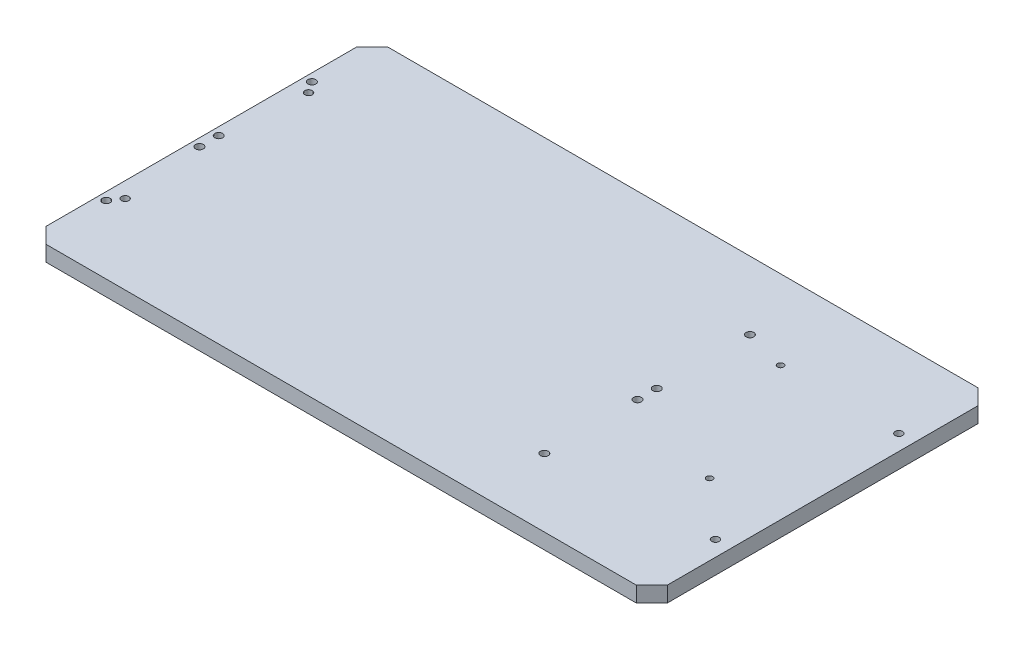
ISO-10303-21;
HEADER;
FILE_DESCRIPTION(('STEP AP214'),'2;1');
FILE_NAME('part.step','',(''),(''),'','','');
FILE_SCHEMA(('AUTOMOTIVE_DESIGN { 1 0 10303 214 1 1 1 1 }'));
ENDSEC;
DATA;
#1=APPLICATION_CONTEXT('core data for automotive mechanical design processes');
#2=APPLICATION_PROTOCOL_DEFINITION('international standard','automotive_design',2000,#1);
#3=PRODUCT_CONTEXT('',#1,'mechanical');
#4=PRODUCT('Part','Part','',(#3));
#5=PRODUCT_RELATED_PRODUCT_CATEGORY('part','',(#4));
#6=PRODUCT_DEFINITION_FORMATION('','',#4);
#7=PRODUCT_DEFINITION_CONTEXT('part definition',#1,'design');
#8=PRODUCT_DEFINITION('design','',#6,#7);
#9=PRODUCT_DEFINITION_SHAPE('','',#8);
#10=(LENGTH_UNIT() NAMED_UNIT(*) SI_UNIT(.MILLI.,.METRE.));
#11=(NAMED_UNIT(*) PLANE_ANGLE_UNIT() SI_UNIT($,.RADIAN.));
#12=(NAMED_UNIT(*) SI_UNIT($,.STERADIAN.) SOLID_ANGLE_UNIT());
#13=UNCERTAINTY_MEASURE_WITH_UNIT(LENGTH_MEASURE(1.E-05),#10,'distance_accuracy_value','');
#14=(GEOMETRIC_REPRESENTATION_CONTEXT(3) GLOBAL_UNCERTAINTY_ASSIGNED_CONTEXT((#13)) GLOBAL_UNIT_ASSIGNED_CONTEXT((#10,
#11,#12)) REPRESENTATION_CONTEXT('',''));
#15=CARTESIAN_POINT('',(0.,0.,0.));
#16=DIRECTION('',(0.,0.,1.));
#17=DIRECTION('',(1.,0.,0.));
#18=AXIS2_PLACEMENT_3D('',#15,#16,#17);
#19=CARTESIAN_POINT('',(0.,6.35,0.));
#20=DIRECTION('',(0.,-1.,0.));
#21=DIRECTION('',(0.,0.,-1.));
#22=AXIS2_PLACEMENT_3D('',#19,#20,#21);
#23=PLANE('',#22);
#24=CARTESIAN_POINT('',(224.824,6.35,-52.805));
#25=DIRECTION('',(0.,1.,0.));
#26=DIRECTION('',(0.,0.,1.));
#27=AXIS2_PLACEMENT_3D('',#24,#25,#26);
#28=CIRCLE('',#27,1.25000000000001);
#29=CARTESIAN_POINT('',(224.824,6.35,-51.555));
#30=VERTEX_POINT('',#29);
#31=EDGE_CURVE('E257',#30,#30,#28,.T.);
#32=ORIENTED_EDGE('',*,*,#31,.F.);
#33=EDGE_LOOP('',(#32));
#34=FACE_BOUND('',#33,.T.);
#35=CARTESIAN_POINT('',(199.324,6.35,-107.305));
#36=DIRECTION('',(0.,1.,0.));
#37=DIRECTION('',(0.,0.,1.));
#38=AXIS2_PLACEMENT_3D('',#35,#36,#37);
#39=CIRCLE('',#38,1.25000000000001);
#40=CARTESIAN_POINT('',(199.324,6.35,-106.055));
#41=VERTEX_POINT('',#40);
#42=EDGE_CURVE('E251',#41,#41,#39,.T.);
#43=ORIENTED_EDGE('',*,*,#42,.F.);
#44=EDGE_LOOP('',(#43));
#45=FACE_BOUND('',#44,.T.);
#46=CARTESIAN_POINT('',(182.245,6.35,-73.787));
#47=DIRECTION('',(0.,1.,0.));
#48=DIRECTION('',(0.,0.,-1.));
#49=AXIS2_PLACEMENT_3D('',#46,#47,#48);
#50=CIRCLE('',#49,1.58749999999999);
#51=CARTESIAN_POINT('',(182.245,6.35,-75.3745));
#52=VERTEX_POINT('',#51);
#53=EDGE_CURVE('E236',#52,#52,#50,.T.);
#54=ORIENTED_EDGE('',*,*,#53,.F.);
#55=EDGE_LOOP('',(#54));
#56=FACE_BOUND('',#55,.T.);
#57=CARTESIAN_POINT('',(182.245,6.35,-27.813));
#58=DIRECTION('',(0.,1.,0.));
#59=DIRECTION('',(0.,0.,-1.));
#60=AXIS2_PLACEMENT_3D('',#57,#58,#59);
#61=CIRCLE('',#60,1.58749999999999);
#62=CARTESIAN_POINT('',(182.245,6.35,-29.4005));
#63=VERTEX_POINT('',#62);
#64=EDGE_CURVE('E224',#63,#63,#61,.T.);
#65=ORIENTED_EDGE('',*,*,#64,.F.);
#66=EDGE_LOOP('',(#65));
#67=FACE_BOUND('',#66,.T.);
#68=CARTESIAN_POINT('',(3.17500000000002,6.35,-27.813));
#69=DIRECTION('',(0.,1.,0.));
#70=DIRECTION('',(0.,0.,1.));
#71=AXIS2_PLACEMENT_3D('',#68,#69,#70);
#72=CIRCLE('',#71,1.5875);
#73=CARTESIAN_POINT('',(3.17500000000002,6.35,-26.2255));
#74=VERTEX_POINT('',#73);
#75=EDGE_CURVE('E212',#74,#74,#72,.T.);
#76=ORIENTED_EDGE('',*,*,#75,.F.);
#77=EDGE_LOOP('',(#76));
#78=FACE_BOUND('',#77,.T.);
#79=CARTESIAN_POINT('',(3.17500000000001,6.35,-73.787));
#80=DIRECTION('',(0.,1.,0.));
#81=DIRECTION('',(0.,0.,1.));
#82=AXIS2_PLACEMENT_3D('',#79,#80,#81);
#83=CIRCLE('',#82,1.58749999999999);
#84=CARTESIAN_POINT('',(3.17500000000001,6.35,-72.1995));
#85=VERTEX_POINT('',#84);
#86=EDGE_CURVE('E200',#85,#85,#83,.T.);
#87=ORIENTED_EDGE('',*,*,#86,.F.);
#88=EDGE_LOOP('',(#87));
#89=FACE_BOUND('',#88,.T.);
#90=CARTESIAN_POINT('',(247.65,6.35,-107.3404));
#91=DIRECTION('',(0.,1.,0.));
#92=DIRECTION('',(0.,0.,-1.));
#93=AXIS2_PLACEMENT_3D('',#90,#91,#92);
#94=CIRCLE('',#93,1.49999999999997);
#95=CARTESIAN_POINT('',(247.65,6.35,-108.8404));
#96=VERTEX_POINT('',#95);
#97=EDGE_CURVE('E188',#96,#96,#94,.T.);
#98=ORIENTED_EDGE('',*,*,#97,.F.);
#99=EDGE_LOOP('',(#98));
#100=FACE_BOUND('',#99,.T.);
#101=CARTESIAN_POINT('',(6.35000000000001,6.35,-107.3404));
#102=DIRECTION('',(0.,1.,0.));
#103=DIRECTION('',(0.,0.,1.));
#104=AXIS2_PLACEMENT_3D('',#101,#102,#103);
#105=CIRCLE('',#104,1.5);
#106=CARTESIAN_POINT('',(6.35000000000001,6.35,-105.8404));
#107=VERTEX_POINT('',#106);
#108=EDGE_CURVE('E174',#107,#107,#105,.T.);
#109=ORIENTED_EDGE('',*,*,#108,.F.);
#110=EDGE_LOOP('',(#109));
#111=FACE_BOUND('',#110,.T.);
#112=DIRECTION('',(-1.,0.,0.));
#113=VECTOR('',#112,1.);
#114=CARTESIAN_POINT('',(254.,6.35,-139.7));
#115=LINE('',#114,#113);
#116=CARTESIAN_POINT('',(247.65,6.35,-139.7));
#117=VERTEX_POINT('',#116);
#118=CARTESIAN_POINT('',(6.35000000000006,6.35,-139.7));
#119=VERTEX_POINT('',#118);
#120=EDGE_CURVE('E169',#117,#119,#115,.T.);
#121=ORIENTED_EDGE('',*,*,#120,.T.);
#122=DIRECTION('',(0.707106781186548,0.,-0.707106781186548));
#123=VECTOR('',#122,1.);
#124=CARTESIAN_POINT('',(0.,6.35,-133.35));
#125=LINE('',#124,#123);
#126=CARTESIAN_POINT('',(0.,6.35,-133.35));
#127=VERTEX_POINT('',#126);
#128=EDGE_CURVE('E150',#119,#127,#125,.F.);
#129=ORIENTED_EDGE('',*,*,#128,.T.);
#130=DIRECTION('',(0.,0.,1.));
#131=VECTOR('',#130,1.);
#132=CARTESIAN_POINT('',(0.,6.35,-139.7));
#133=LINE('',#132,#131);
#134=CARTESIAN_POINT('',(0.,6.35,-6.35000000000004));
#135=VERTEX_POINT('',#134);
#136=EDGE_CURVE('E120',#127,#135,#133,.T.);
#137=ORIENTED_EDGE('',*,*,#136,.T.);
#138=DIRECTION('',(-0.707106781186548,0.,-0.707106781186548));
#139=VECTOR('',#138,1.);
#140=CARTESIAN_POINT('',(6.35000000000002,6.35,0.));
#141=LINE('',#140,#139);
#142=CARTESIAN_POINT('',(6.35000000000008,6.35,0.));
#143=VERTEX_POINT('',#142);
#144=EDGE_CURVE('E56',#135,#143,#141,.F.);
#145=ORIENTED_EDGE('',*,*,#144,.T.);
#146=DIRECTION('',(1.,0.,0.));
#147=VECTOR('',#146,1.);
#148=CARTESIAN_POINT('',(254.,6.35,0.));
#149=LINE('',#148,#147);
#150=CARTESIAN_POINT('',(247.65,6.35,0.));
#151=VERTEX_POINT('',#150);
#152=EDGE_CURVE('E136',#143,#151,#149,.T.);
#153=ORIENTED_EDGE('',*,*,#152,.T.);
#154=DIRECTION('',(-0.707106781186548,0.,0.707106781186548));
#155=VECTOR('',#154,1.);
#156=CARTESIAN_POINT('',(254.,6.35,-6.35000000000002));
#157=LINE('',#156,#155);
#158=CARTESIAN_POINT('',(254.,6.35,-6.35000000000004));
#159=VERTEX_POINT('',#158);
#160=EDGE_CURVE('E147',#151,#159,#157,.F.);
#161=ORIENTED_EDGE('',*,*,#160,.T.);
#162=DIRECTION('',(0.,0.,-1.));
#163=VECTOR('',#162,1.);
#164=CARTESIAN_POINT('',(254.,6.35,-139.7));
#165=LINE('',#164,#163);
#166=CARTESIAN_POINT('',(254.,6.35,-133.35));
#167=VERTEX_POINT('',#166);
#168=EDGE_CURVE('E130',#159,#167,#165,.T.);
#169=ORIENTED_EDGE('',*,*,#168,.T.);
#170=DIRECTION('',(0.707106781186549,0.,0.707106781186546));
#171=VECTOR('',#170,1.);
#172=CARTESIAN_POINT('',(247.65,6.35,-139.7));
#173=LINE('',#172,#171);
#174=EDGE_CURVE('E145',#167,#117,#173,.F.);
#175=ORIENTED_EDGE('',*,*,#174,.T.);
#176=EDGE_LOOP('',(#121,#129,#137,#145,#153,#161,#169,#175));
#177=FACE_BOUND('',#176,.T.);
#178=CARTESIAN_POINT('',(6.35000000000001,6.35,-32.3596));
#179=DIRECTION('',(0.,1.,0.));
#180=DIRECTION('',(0.,0.,1.));
#181=AXIS2_PLACEMENT_3D('',#178,#179,#180);
#182=CIRCLE('',#181,1.5);
#183=CARTESIAN_POINT('',(6.35000000000001,6.35,-30.8596));
#184=VERTEX_POINT('',#183);
#185=EDGE_CURVE('E183',#184,#184,#182,.T.);
#186=ORIENTED_EDGE('',*,*,#185,.F.);
#187=EDGE_LOOP('',(#186));
#188=FACE_BOUND('',#187,.T.);
#189=CARTESIAN_POINT('',(247.65,6.35,-32.3596));
#190=DIRECTION('',(0.,1.,0.));
#191=DIRECTION('',(0.,0.,-1.));
#192=AXIS2_PLACEMENT_3D('',#189,#190,#191);
#193=CIRCLE('',#192,1.49999999999997);
#194=CARTESIAN_POINT('',(247.65,6.35,-33.8596));
#195=VERTEX_POINT('',#194);
#196=EDGE_CURVE('E194',#195,#195,#193,.T.);
#197=ORIENTED_EDGE('',*,*,#196,.F.);
#198=EDGE_LOOP('',(#197));
#199=FACE_BOUND('',#198,.T.);
#200=CARTESIAN_POINT('',(3.17500000000001,6.35,-65.913));
#201=DIRECTION('',(0.,1.,0.));
#202=DIRECTION('',(0.,0.,1.));
#203=AXIS2_PLACEMENT_3D('',#200,#201,#202);
#204=CIRCLE('',#203,1.5875);
#205=CARTESIAN_POINT('',(3.17500000000001,6.35,-64.3255));
#206=VERTEX_POINT('',#205);
#207=EDGE_CURVE('E206',#206,#206,#204,.T.);
#208=ORIENTED_EDGE('',*,*,#207,.F.);
#209=EDGE_LOOP('',(#208));
#210=FACE_BOUND('',#209,.T.);
#211=CARTESIAN_POINT('',(3.17500000000001,6.35,-111.887));
#212=DIRECTION('',(0.,1.,0.));
#213=DIRECTION('',(0.,0.,1.));
#214=AXIS2_PLACEMENT_3D('',#211,#212,#213);
#215=CIRCLE('',#214,1.5875);
#216=CARTESIAN_POINT('',(3.17500000000001,6.35,-110.2995));
#217=VERTEX_POINT('',#216);
#218=EDGE_CURVE('E218',#217,#217,#215,.T.);
#219=ORIENTED_EDGE('',*,*,#218,.F.);
#220=EDGE_LOOP('',(#219));
#221=FACE_BOUND('',#220,.T.);
#222=CARTESIAN_POINT('',(182.245,6.35,-65.913));
#223=DIRECTION('',(0.,1.,0.));
#224=DIRECTION('',(0.,0.,-1.));
#225=AXIS2_PLACEMENT_3D('',#222,#223,#224);
#226=CIRCLE('',#225,1.58750000000002);
#227=CARTESIAN_POINT('',(182.245,6.35,-67.5005));
#228=VERTEX_POINT('',#227);
#229=EDGE_CURVE('E230',#228,#228,#226,.T.);
#230=ORIENTED_EDGE('',*,*,#229,.F.);
#231=EDGE_LOOP('',(#230));
#232=FACE_BOUND('',#231,.T.);
#233=CARTESIAN_POINT('',(182.245,6.35,-111.887));
#234=DIRECTION('',(0.,1.,0.));
#235=DIRECTION('',(0.,0.,-1.));
#236=AXIS2_PLACEMENT_3D('',#233,#234,#235);
#237=CIRCLE('',#236,1.58749999999999);
#238=CARTESIAN_POINT('',(182.245,6.35,-113.4745));
#239=VERTEX_POINT('',#238);
#240=EDGE_CURVE('E242',#239,#239,#237,.T.);
#241=ORIENTED_EDGE('',*,*,#240,.F.);
#242=EDGE_LOOP('',(#241));
#243=FACE_BOUND('',#242,.T.);
#244=ADVANCED_FACE('F34',(#34,#45,#56,#67,#78,#89,#100,#111,#177,#188,#199,#210,#221,#232,#243),
#23,.F.);
#245=CARTESIAN_POINT('',(0.,0.,0.));
#246=DIRECTION('',(0.,-1.,0.));
#247=DIRECTION('',(0.,0.,-1.));
#248=AXIS2_PLACEMENT_3D('',#245,#246,#247);
#249=PLANE('',#248);
#250=CARTESIAN_POINT('',(224.824,0.,-52.805));
#251=DIRECTION('',(0.,1.,0.));
#252=DIRECTION('',(0.,0.,1.));
#253=AXIS2_PLACEMENT_3D('',#250,#251,#252);
#254=CIRCLE('',#253,1.25000000000001);
#255=CARTESIAN_POINT('',(224.824,0.,-51.555));
#256=VERTEX_POINT('',#255);
#257=EDGE_CURVE('E254',#256,#256,#254,.T.);
#258=ORIENTED_EDGE('',*,*,#257,.T.);
#259=EDGE_LOOP('',(#258));
#260=FACE_BOUND('',#259,.T.);
#261=CARTESIAN_POINT('',(199.324,0.,-107.305));
#262=DIRECTION('',(0.,1.,0.));
#263=DIRECTION('',(0.,0.,1.));
#264=AXIS2_PLACEMENT_3D('',#261,#262,#263);
#265=CIRCLE('',#264,1.25000000000001);
#266=CARTESIAN_POINT('',(199.324,0.,-106.055));
#267=VERTEX_POINT('',#266);
#268=EDGE_CURVE('E248',#267,#267,#265,.T.);
#269=ORIENTED_EDGE('',*,*,#268,.T.);
#270=EDGE_LOOP('',(#269));
#271=FACE_BOUND('',#270,.T.);
#272=CARTESIAN_POINT('',(182.245,0.,-73.787));
#273=DIRECTION('',(0.,1.,0.));
#274=DIRECTION('',(0.,0.,-1.));
#275=AXIS2_PLACEMENT_3D('',#272,#273,#274);
#276=CIRCLE('',#275,1.58749999999999);
#277=CARTESIAN_POINT('',(182.245,0.,-75.3745));
#278=VERTEX_POINT('',#277);
#279=EDGE_CURVE('E239',#278,#278,#276,.T.);
#280=ORIENTED_EDGE('',*,*,#279,.T.);
#281=EDGE_LOOP('',(#280));
#282=FACE_BOUND('',#281,.T.);
#283=CARTESIAN_POINT('',(182.245,0.,-27.813));
#284=DIRECTION('',(0.,1.,0.));
#285=DIRECTION('',(0.,0.,-1.));
#286=AXIS2_PLACEMENT_3D('',#283,#284,#285);
#287=CIRCLE('',#286,1.58749999999999);
#288=CARTESIAN_POINT('',(182.245,0.,-29.4005));
#289=VERTEX_POINT('',#288);
#290=EDGE_CURVE('E227',#289,#289,#287,.T.);
#291=ORIENTED_EDGE('',*,*,#290,.T.);
#292=EDGE_LOOP('',(#291));
#293=FACE_BOUND('',#292,.T.);
#294=CARTESIAN_POINT('',(3.17500000000002,0.,-27.813));
#295=DIRECTION('',(0.,1.,0.));
#296=DIRECTION('',(0.,0.,1.));
#297=AXIS2_PLACEMENT_3D('',#294,#295,#296);
#298=CIRCLE('',#297,1.5875);
#299=CARTESIAN_POINT('',(3.17500000000002,0.,-26.2255));
#300=VERTEX_POINT('',#299);
#301=EDGE_CURVE('E215',#300,#300,#298,.T.);
#302=ORIENTED_EDGE('',*,*,#301,.T.);
#303=EDGE_LOOP('',(#302));
#304=FACE_BOUND('',#303,.T.);
#305=CARTESIAN_POINT('',(3.17500000000001,0.,-73.787));
#306=DIRECTION('',(0.,1.,0.));
#307=DIRECTION('',(0.,0.,1.));
#308=AXIS2_PLACEMENT_3D('',#305,#306,#307);
#309=CIRCLE('',#308,1.58749999999999);
#310=CARTESIAN_POINT('',(3.17500000000001,0.,-72.1995));
#311=VERTEX_POINT('',#310);
#312=EDGE_CURVE('E203',#311,#311,#309,.T.);
#313=ORIENTED_EDGE('',*,*,#312,.T.);
#314=EDGE_LOOP('',(#313));
#315=FACE_BOUND('',#314,.T.);
#316=CARTESIAN_POINT('',(247.65,0.,-107.3404));
#317=DIRECTION('',(0.,1.,0.));
#318=DIRECTION('',(0.,0.,-1.));
#319=AXIS2_PLACEMENT_3D('',#316,#317,#318);
#320=CIRCLE('',#319,1.49999999999997);
#321=CARTESIAN_POINT('',(247.65,0.,-108.8404));
#322=VERTEX_POINT('',#321);
#323=EDGE_CURVE('E191',#322,#322,#320,.T.);
#324=ORIENTED_EDGE('',*,*,#323,.T.);
#325=EDGE_LOOP('',(#324));
#326=FACE_BOUND('',#325,.T.);
#327=CARTESIAN_POINT('',(6.35000000000001,0.,-107.3404));
#328=DIRECTION('',(0.,1.,0.));
#329=DIRECTION('',(0.,0.,1.));
#330=AXIS2_PLACEMENT_3D('',#327,#328,#329);
#331=CIRCLE('',#330,1.5);
#332=CARTESIAN_POINT('',(6.35000000000001,0.,-105.8404));
#333=VERTEX_POINT('',#332);
#334=EDGE_CURVE('E176',#333,#333,#331,.T.);
#335=ORIENTED_EDGE('',*,*,#334,.T.);
#336=EDGE_LOOP('',(#335));
#337=FACE_BOUND('',#336,.T.);
#338=DIRECTION('',(0.,0.,1.));
#339=VECTOR('',#338,1.);
#340=CARTESIAN_POINT('',(0.,0.,-139.7));
#341=LINE('',#340,#339);
#342=CARTESIAN_POINT('',(0.,0.,-133.35));
#343=VERTEX_POINT('',#342);
#344=CARTESIAN_POINT('',(0.,0.,-6.35000000000002));
#345=VERTEX_POINT('',#344);
#346=EDGE_CURVE('E118',#343,#345,#341,.T.);
#347=ORIENTED_EDGE('',*,*,#346,.F.);
#348=DIRECTION('',(-0.707106781186548,0.,0.707106781186548));
#349=VECTOR('',#348,1.);
#350=CARTESIAN_POINT('',(-66.675,0.,-66.675));
#351=LINE('',#350,#349);
#352=CARTESIAN_POINT('',(6.35000000000002,0.,-139.7));
#353=VERTEX_POINT('',#352);
#354=EDGE_CURVE('E101',#343,#353,#351,.F.);
#355=ORIENTED_EDGE('',*,*,#354,.T.);
#356=DIRECTION('',(-1.,0.,0.));
#357=VECTOR('',#356,1.);
#358=CARTESIAN_POINT('',(254.,0.,-139.7));
#359=LINE('',#358,#357);
#360=CARTESIAN_POINT('',(247.65,0.,-139.7));
#361=VERTEX_POINT('',#360);
#362=EDGE_CURVE('E128',#361,#353,#359,.T.);
#363=ORIENTED_EDGE('',*,*,#362,.F.);
#364=DIRECTION('',(-0.707106781186549,0.,-0.707106781186546));
#365=VECTOR('',#364,1.);
#366=CARTESIAN_POINT('',(193.674999999999,0.,-193.675));
#367=LINE('',#366,#365);
#368=CARTESIAN_POINT('',(254.,0.,-133.35));
#369=VERTEX_POINT('',#368);
#370=EDGE_CURVE('E121',#361,#369,#367,.F.);
#371=ORIENTED_EDGE('',*,*,#370,.T.);
#372=DIRECTION('',(0.,0.,-1.));
#373=VECTOR('',#372,1.);
#374=CARTESIAN_POINT('',(254.,0.,-139.7));
#375=LINE('',#374,#373);
#376=CARTESIAN_POINT('',(254.,0.,-6.35000000000013));
#377=VERTEX_POINT('',#376);
#378=EDGE_CURVE('E132',#377,#369,#375,.T.);
#379=ORIENTED_EDGE('',*,*,#378,.F.);
#380=DIRECTION('',(0.707106781186548,0.,-0.707106781186548));
#381=VECTOR('',#380,1.);
#382=CARTESIAN_POINT('',(123.825,0.,123.825));
#383=LINE('',#382,#381);
#384=CARTESIAN_POINT('',(247.65,0.,0.));
#385=VERTEX_POINT('',#384);
#386=EDGE_CURVE('E139',#377,#385,#383,.F.);
#387=ORIENTED_EDGE('',*,*,#386,.T.);
#388=DIRECTION('',(1.,0.,0.));
#389=VECTOR('',#388,1.);
#390=CARTESIAN_POINT('',(254.,0.,0.));
#391=LINE('',#390,#389);
#392=CARTESIAN_POINT('',(6.35000000000011,0.,0.));
#393=VERTEX_POINT('',#392);
#394=EDGE_CURVE('E127',#393,#385,#391,.T.);
#395=ORIENTED_EDGE('',*,*,#394,.F.);
#396=DIRECTION('',(0.707106781186548,0.,0.707106781186548));
#397=VECTOR('',#396,1.);
#398=CARTESIAN_POINT('',(3.17500000000001,0.,-3.17500000000001));
#399=LINE('',#398,#397);
#400=EDGE_CURVE('E112',#393,#345,#399,.F.);
#401=ORIENTED_EDGE('',*,*,#400,.T.);
#402=EDGE_LOOP('',(#347,#355,#363,#371,#379,#387,#395,#401));
#403=FACE_BOUND('',#402,.T.);
#404=CARTESIAN_POINT('',(6.35000000000001,0.,-32.3596));
#405=DIRECTION('',(0.,1.,0.));
#406=DIRECTION('',(0.,0.,1.));
#407=AXIS2_PLACEMENT_3D('',#404,#405,#406);
#408=CIRCLE('',#407,1.5);
#409=CARTESIAN_POINT('',(6.35000000000001,0.,-30.8596));
#410=VERTEX_POINT('',#409);
#411=EDGE_CURVE('E185',#410,#410,#408,.T.);
#412=ORIENTED_EDGE('',*,*,#411,.T.);
#413=EDGE_LOOP('',(#412));
#414=FACE_BOUND('',#413,.T.);
#415=CARTESIAN_POINT('',(247.65,0.,-32.3596));
#416=DIRECTION('',(0.,1.,0.));
#417=DIRECTION('',(0.,0.,-1.));
#418=AXIS2_PLACEMENT_3D('',#415,#416,#417);
#419=CIRCLE('',#418,1.49999999999997);
#420=CARTESIAN_POINT('',(247.65,0.,-33.8596));
#421=VERTEX_POINT('',#420);
#422=EDGE_CURVE('E197',#421,#421,#419,.T.);
#423=ORIENTED_EDGE('',*,*,#422,.T.);
#424=EDGE_LOOP('',(#423));
#425=FACE_BOUND('',#424,.T.);
#426=CARTESIAN_POINT('',(3.17500000000001,0.,-65.913));
#427=DIRECTION('',(0.,1.,0.));
#428=DIRECTION('',(0.,0.,1.));
#429=AXIS2_PLACEMENT_3D('',#426,#427,#428);
#430=CIRCLE('',#429,1.5875);
#431=CARTESIAN_POINT('',(3.17500000000001,0.,-64.3255));
#432=VERTEX_POINT('',#431);
#433=EDGE_CURVE('E209',#432,#432,#430,.T.);
#434=ORIENTED_EDGE('',*,*,#433,.T.);
#435=EDGE_LOOP('',(#434));
#436=FACE_BOUND('',#435,.T.);
#437=CARTESIAN_POINT('',(3.17500000000001,0.,-111.887));
#438=DIRECTION('',(0.,1.,0.));
#439=DIRECTION('',(0.,0.,1.));
#440=AXIS2_PLACEMENT_3D('',#437,#438,#439);
#441=CIRCLE('',#440,1.5875);
#442=CARTESIAN_POINT('',(3.17500000000001,0.,-110.2995));
#443=VERTEX_POINT('',#442);
#444=EDGE_CURVE('E221',#443,#443,#441,.T.);
#445=ORIENTED_EDGE('',*,*,#444,.T.);
#446=EDGE_LOOP('',(#445));
#447=FACE_BOUND('',#446,.T.);
#448=CARTESIAN_POINT('',(182.245,0.,-65.913));
#449=DIRECTION('',(0.,1.,0.));
#450=DIRECTION('',(0.,0.,-1.));
#451=AXIS2_PLACEMENT_3D('',#448,#449,#450);
#452=CIRCLE('',#451,1.58750000000002);
#453=CARTESIAN_POINT('',(182.245,0.,-67.5005));
#454=VERTEX_POINT('',#453);
#455=EDGE_CURVE('E233',#454,#454,#452,.T.);
#456=ORIENTED_EDGE('',*,*,#455,.T.);
#457=EDGE_LOOP('',(#456));
#458=FACE_BOUND('',#457,.T.);
#459=CARTESIAN_POINT('',(182.245,0.,-111.887));
#460=DIRECTION('',(0.,1.,0.));
#461=DIRECTION('',(0.,0.,-1.));
#462=AXIS2_PLACEMENT_3D('',#459,#460,#461);
#463=CIRCLE('',#462,1.58749999999999);
#464=CARTESIAN_POINT('',(182.245,0.,-113.4745));
#465=VERTEX_POINT('',#464);
#466=EDGE_CURVE('E245',#465,#465,#463,.T.);
#467=ORIENTED_EDGE('',*,*,#466,.T.);
#468=EDGE_LOOP('',(#467));
#469=FACE_BOUND('',#468,.T.);
#470=ADVANCED_FACE('F124',(#260,#271,#282,#293,#304,#315,#326,#337,#403,#414,#425,#436,#447,
#458,#469),#249,.T.);
#471=CARTESIAN_POINT('',(254.,6.35,-139.7));
#472=DIRECTION('',(-1.,0.,0.));
#473=DIRECTION('',(0.,0.,1.));
#474=AXIS2_PLACEMENT_3D('',#471,#472,#473);
#475=PLANE('',#474);
#476=ORIENTED_EDGE('',*,*,#168,.F.);
#477=DIRECTION('',(0.,-1.,0.));
#478=VECTOR('',#477,1.);
#479=CARTESIAN_POINT('',(254.,6.35,-6.35000000000002));
#480=LINE('',#479,#478);
#481=EDGE_CURVE('E11',#159,#377,#480,.T.);
#482=ORIENTED_EDGE('',*,*,#481,.T.);
#483=ORIENTED_EDGE('',*,*,#378,.T.);
#484=DIRECTION('',(0.,1.,0.));
#485=VECTOR('',#484,1.);
#486=CARTESIAN_POINT('',(254.,6.35,-133.35));
#487=LINE('',#486,#485);
#488=EDGE_CURVE('E42',#369,#167,#487,.T.);
#489=ORIENTED_EDGE('',*,*,#488,.T.);
#490=EDGE_LOOP('',(#476,#482,#483,#489));
#491=FACE_BOUND('',#490,.T.);
#492=ADVANCED_FACE('F160',(#491),#475,.F.);
#493=CARTESIAN_POINT('',(254.,6.35,-139.7));
#494=DIRECTION('',(0.,0.,1.));
#495=DIRECTION('',(1.,0.,0.));
#496=AXIS2_PLACEMENT_3D('',#493,#494,#495);
#497=PLANE('',#496);
#498=ORIENTED_EDGE('',*,*,#362,.T.);
#499=DIRECTION('',(0.,1.,0.));
#500=VECTOR('',#499,1.);
#501=CARTESIAN_POINT('',(6.35000000000002,6.35,-139.7));
#502=LINE('',#501,#500);
#503=EDGE_CURVE('E106',#353,#119,#502,.T.);
#504=ORIENTED_EDGE('',*,*,#503,.T.);
#505=ORIENTED_EDGE('',*,*,#120,.F.);
#506=DIRECTION('',(0.,-1.,0.));
#507=VECTOR('',#506,1.);
#508=CARTESIAN_POINT('',(247.65,6.35,-139.7));
#509=LINE('',#508,#507);
#510=EDGE_CURVE('E111',#117,#361,#509,.T.);
#511=ORIENTED_EDGE('',*,*,#510,.T.);
#512=EDGE_LOOP('',(#498,#504,#505,#511));
#513=FACE_BOUND('',#512,.T.);
#514=ADVANCED_FACE('F173',(#513),#497,.F.);
#515=CARTESIAN_POINT('',(0.,6.35,-139.7));
#516=DIRECTION('',(1.,0.,0.));
#517=DIRECTION('',(0.,0.,-1.));
#518=AXIS2_PLACEMENT_3D('',#515,#516,#517);
#519=PLANE('',#518);
#520=ORIENTED_EDGE('',*,*,#136,.F.);
#521=DIRECTION('',(0.,-1.,0.));
#522=VECTOR('',#521,1.);
#523=CARTESIAN_POINT('',(0.,6.35,-133.35));
#524=LINE('',#523,#522);
#525=EDGE_CURVE('E105',#127,#343,#524,.T.);
#526=ORIENTED_EDGE('',*,*,#525,.T.);
#527=ORIENTED_EDGE('',*,*,#346,.T.);
#528=DIRECTION('',(0.,1.,0.));
#529=VECTOR('',#528,1.);
#530=CARTESIAN_POINT('',(0.,6.35,-6.35000000000002));
#531=LINE('',#530,#529);
#532=EDGE_CURVE('E122',#345,#135,#531,.T.);
#533=ORIENTED_EDGE('',*,*,#532,.T.);
#534=EDGE_LOOP('',(#520,#526,#527,#533));
#535=FACE_BOUND('',#534,.T.);
#536=ADVANCED_FACE('F117',(#535),#519,.F.);
#537=CARTESIAN_POINT('',(254.,6.35,0.));
#538=DIRECTION('',(0.,0.,-1.));
#539=DIRECTION('',(-1.,0.,0.));
#540=AXIS2_PLACEMENT_3D('',#537,#538,#539);
#541=PLANE('',#540);
#542=ORIENTED_EDGE('',*,*,#152,.F.);
#543=DIRECTION('',(0.,-1.,0.));
#544=VECTOR('',#543,1.);
#545=CARTESIAN_POINT('',(6.35000000000002,6.35,0.));
#546=LINE('',#545,#544);
#547=EDGE_CURVE('E153',#143,#393,#546,.T.);
#548=ORIENTED_EDGE('',*,*,#547,.T.);
#549=ORIENTED_EDGE('',*,*,#394,.T.);
#550=DIRECTION('',(0.,1.,0.));
#551=VECTOR('',#550,1.);
#552=CARTESIAN_POINT('',(247.65,6.35,0.));
#553=LINE('',#552,#551);
#554=EDGE_CURVE('E49',#385,#151,#553,.T.);
#555=ORIENTED_EDGE('',*,*,#554,.T.);
#556=EDGE_LOOP('',(#542,#548,#549,#555));
#557=FACE_BOUND('',#556,.T.);
#558=ADVANCED_FACE('F293',(#557),#541,.F.);
#559=CARTESIAN_POINT('',(6.35000000000001,6.35,-107.3404));
#560=DIRECTION('',(0.,-1.,0.));
#561=DIRECTION('',(0.,0.,-1.));
#562=AXIS2_PLACEMENT_3D('',#559,#560,#561);
#563=CYLINDRICAL_SURFACE('',#562,1.5);
#564=ORIENTED_EDGE('',*,*,#108,.T.);
#565=EDGE_LOOP('',(#564));
#566=FACE_BOUND('',#565,.T.);
#567=ORIENTED_EDGE('',*,*,#334,.F.);
#568=EDGE_LOOP('',(#567));
#569=FACE_BOUND('',#568,.T.);
#570=ADVANCED_FACE('F289',(#566,#569),#563,.F.);
#571=CARTESIAN_POINT('',(6.35000000000001,6.35,-32.3596));
#572=DIRECTION('',(0.,-1.,0.));
#573=DIRECTION('',(0.,0.,-1.));
#574=AXIS2_PLACEMENT_3D('',#571,#572,#573);
#575=CYLINDRICAL_SURFACE('',#574,1.5);
#576=ORIENTED_EDGE('',*,*,#185,.T.);
#577=EDGE_LOOP('',(#576));
#578=FACE_BOUND('',#577,.T.);
#579=ORIENTED_EDGE('',*,*,#411,.F.);
#580=EDGE_LOOP('',(#579));
#581=FACE_BOUND('',#580,.T.);
#582=ADVANCED_FACE('F292',(#578,#581),#575,.F.);
#583=CARTESIAN_POINT('',(247.65,6.35,-107.3404));
#584=DIRECTION('',(0.,-1.,0.));
#585=DIRECTION('',(0.,0.,-1.));
#586=AXIS2_PLACEMENT_3D('',#583,#584,#585);
#587=CYLINDRICAL_SURFACE('',#586,1.49999999999997);
#588=ORIENTED_EDGE('',*,*,#97,.T.);
#589=EDGE_LOOP('',(#588));
#590=FACE_BOUND('',#589,.T.);
#591=ORIENTED_EDGE('',*,*,#323,.F.);
#592=EDGE_LOOP('',(#591));
#593=FACE_BOUND('',#592,.T.);
#594=ADVANCED_FACE('F479',(#590,#593),#587,.F.);
#595=CARTESIAN_POINT('',(247.65,6.35,-32.3596));
#596=DIRECTION('',(0.,-1.,0.));
#597=DIRECTION('',(0.,0.,-1.));
#598=AXIS2_PLACEMENT_3D('',#595,#596,#597);
#599=CYLINDRICAL_SURFACE('',#598,1.49999999999997);
#600=ORIENTED_EDGE('',*,*,#196,.T.);
#601=EDGE_LOOP('',(#600));
#602=FACE_BOUND('',#601,.T.);
#603=ORIENTED_EDGE('',*,*,#422,.F.);
#604=EDGE_LOOP('',(#603));
#605=FACE_BOUND('',#604,.T.);
#606=ADVANCED_FACE('F469',(#602,#605),#599,.F.);
#607=CARTESIAN_POINT('',(3.17500000000001,6.35,-73.787));
#608=DIRECTION('',(0.,-1.,0.));
#609=DIRECTION('',(0.,0.,-1.));
#610=AXIS2_PLACEMENT_3D('',#607,#608,#609);
#611=CYLINDRICAL_SURFACE('',#610,1.58749999999999);
#612=ORIENTED_EDGE('',*,*,#86,.T.);
#613=EDGE_LOOP('',(#612));
#614=FACE_BOUND('',#613,.T.);
#615=ORIENTED_EDGE('',*,*,#312,.F.);
#616=EDGE_LOOP('',(#615));
#617=FACE_BOUND('',#616,.T.);
#618=ADVANCED_FACE('F459',(#614,#617),#611,.F.);
#619=CARTESIAN_POINT('',(3.17500000000001,6.35,-65.913));
#620=DIRECTION('',(0.,-1.,0.));
#621=DIRECTION('',(0.,0.,-1.));
#622=AXIS2_PLACEMENT_3D('',#619,#620,#621);
#623=CYLINDRICAL_SURFACE('',#622,1.5875);
#624=ORIENTED_EDGE('',*,*,#207,.T.);
#625=EDGE_LOOP('',(#624));
#626=FACE_BOUND('',#625,.T.);
#627=ORIENTED_EDGE('',*,*,#433,.F.);
#628=EDGE_LOOP('',(#627));
#629=FACE_BOUND('',#628,.T.);
#630=ADVANCED_FACE('F449',(#626,#629),#623,.F.);
#631=CARTESIAN_POINT('',(3.17500000000002,6.35,-27.813));
#632=DIRECTION('',(0.,-1.,0.));
#633=DIRECTION('',(0.,0.,-1.));
#634=AXIS2_PLACEMENT_3D('',#631,#632,#633);
#635=CYLINDRICAL_SURFACE('',#634,1.5875);
#636=ORIENTED_EDGE('',*,*,#75,.T.);
#637=EDGE_LOOP('',(#636));
#638=FACE_BOUND('',#637,.T.);
#639=ORIENTED_EDGE('',*,*,#301,.F.);
#640=EDGE_LOOP('',(#639));
#641=FACE_BOUND('',#640,.T.);
#642=ADVANCED_FACE('F439',(#638,#641),#635,.F.);
#643=CARTESIAN_POINT('',(3.17500000000001,6.35,-111.887));
#644=DIRECTION('',(0.,-1.,0.));
#645=DIRECTION('',(0.,0.,-1.));
#646=AXIS2_PLACEMENT_3D('',#643,#644,#645);
#647=CYLINDRICAL_SURFACE('',#646,1.5875);
#648=ORIENTED_EDGE('',*,*,#218,.T.);
#649=EDGE_LOOP('',(#648));
#650=FACE_BOUND('',#649,.T.);
#651=ORIENTED_EDGE('',*,*,#444,.F.);
#652=EDGE_LOOP('',(#651));
#653=FACE_BOUND('',#652,.T.);
#654=ADVANCED_FACE('F429',(#650,#653),#647,.F.);
#655=CARTESIAN_POINT('',(182.245,6.35,-27.813));
#656=DIRECTION('',(0.,-1.,0.));
#657=DIRECTION('',(0.,0.,-1.));
#658=AXIS2_PLACEMENT_3D('',#655,#656,#657);
#659=CYLINDRICAL_SURFACE('',#658,1.58749999999999);
#660=ORIENTED_EDGE('',*,*,#64,.T.);
#661=EDGE_LOOP('',(#660));
#662=FACE_BOUND('',#661,.T.);
#663=ORIENTED_EDGE('',*,*,#290,.F.);
#664=EDGE_LOOP('',(#663));
#665=FACE_BOUND('',#664,.T.);
#666=ADVANCED_FACE('F419',(#662,#665),#659,.F.);
#667=CARTESIAN_POINT('',(182.245,6.35,-65.913));
#668=DIRECTION('',(0.,-1.,0.));
#669=DIRECTION('',(0.,0.,-1.));
#670=AXIS2_PLACEMENT_3D('',#667,#668,#669);
#671=CYLINDRICAL_SURFACE('',#670,1.58750000000002);
#672=ORIENTED_EDGE('',*,*,#229,.T.);
#673=EDGE_LOOP('',(#672));
#674=FACE_BOUND('',#673,.T.);
#675=ORIENTED_EDGE('',*,*,#455,.F.);
#676=EDGE_LOOP('',(#675));
#677=FACE_BOUND('',#676,.T.);
#678=ADVANCED_FACE('F409',(#674,#677),#671,.F.);
#679=CARTESIAN_POINT('',(182.245,6.35,-73.787));
#680=DIRECTION('',(0.,-1.,0.));
#681=DIRECTION('',(0.,0.,-1.));
#682=AXIS2_PLACEMENT_3D('',#679,#680,#681);
#683=CYLINDRICAL_SURFACE('',#682,1.58749999999999);
#684=ORIENTED_EDGE('',*,*,#53,.T.);
#685=EDGE_LOOP('',(#684));
#686=FACE_BOUND('',#685,.T.);
#687=ORIENTED_EDGE('',*,*,#279,.F.);
#688=EDGE_LOOP('',(#687));
#689=FACE_BOUND('',#688,.T.);
#690=ADVANCED_FACE('F399',(#686,#689),#683,.F.);
#691=CARTESIAN_POINT('',(182.245,6.35,-111.887));
#692=DIRECTION('',(0.,-1.,0.));
#693=DIRECTION('',(0.,0.,-1.));
#694=AXIS2_PLACEMENT_3D('',#691,#692,#693);
#695=CYLINDRICAL_SURFACE('',#694,1.58749999999999);
#696=ORIENTED_EDGE('',*,*,#240,.T.);
#697=EDGE_LOOP('',(#696));
#698=FACE_BOUND('',#697,.T.);
#699=ORIENTED_EDGE('',*,*,#466,.F.);
#700=EDGE_LOOP('',(#699));
#701=FACE_BOUND('',#700,.T.);
#702=ADVANCED_FACE('F389',(#698,#701),#695,.F.);
#703=CARTESIAN_POINT('',(199.324,0.,-107.305));
#704=DIRECTION('',(0.,1.,0.));
#705=DIRECTION('',(0.,0.,1.));
#706=AXIS2_PLACEMENT_3D('',#703,#704,#705);
#707=CYLINDRICAL_SURFACE('',#706,1.25000000000001);
#708=ORIENTED_EDGE('',*,*,#268,.F.);
#709=EDGE_LOOP('',(#708));
#710=FACE_BOUND('',#709,.T.);
#711=ORIENTED_EDGE('',*,*,#42,.T.);
#712=EDGE_LOOP('',(#711));
#713=FACE_BOUND('',#712,.T.);
#714=ADVANCED_FACE('F268',(#710,#713),#707,.F.);
#715=CARTESIAN_POINT('',(224.824,0.,-52.805));
#716=DIRECTION('',(0.,1.,0.));
#717=DIRECTION('',(0.,0.,1.));
#718=AXIS2_PLACEMENT_3D('',#715,#716,#717);
#719=CYLINDRICAL_SURFACE('',#718,1.25000000000001);
#720=ORIENTED_EDGE('',*,*,#257,.F.);
#721=EDGE_LOOP('',(#720));
#722=FACE_BOUND('',#721,.T.);
#723=ORIENTED_EDGE('',*,*,#31,.T.);
#724=EDGE_LOOP('',(#723));
#725=FACE_BOUND('',#724,.T.);
#726=ADVANCED_FACE('F265',(#722,#725),#719,.F.);
#727=CARTESIAN_POINT('',(0.,6.35,-133.35));
#728=DIRECTION('',(0.707106781186548,0.,0.707106781186548));
#729=DIRECTION('',(0.,-1.,0.));
#730=AXIS2_PLACEMENT_3D('',#727,#728,#729);
#731=PLANE('',#730);
#732=ORIENTED_EDGE('',*,*,#128,.F.);
#733=ORIENTED_EDGE('',*,*,#503,.F.);
#734=ORIENTED_EDGE('',*,*,#354,.F.);
#735=ORIENTED_EDGE('',*,*,#525,.F.);
#736=EDGE_LOOP('',(#732,#733,#734,#735));
#737=FACE_BOUND('',#736,.T.);
#738=ADVANCED_FACE('F104',(#737),#731,.F.);
#739=CARTESIAN_POINT('',(6.35000000000002,6.35,0.));
#740=DIRECTION('',(0.707106781186548,0.,-0.707106781186548));
#741=DIRECTION('',(0.,-1.,0.));
#742=AXIS2_PLACEMENT_3D('',#739,#740,#741);
#743=PLANE('',#742);
#744=ORIENTED_EDGE('',*,*,#144,.F.);
#745=ORIENTED_EDGE('',*,*,#532,.F.);
#746=ORIENTED_EDGE('',*,*,#400,.F.);
#747=ORIENTED_EDGE('',*,*,#547,.F.);
#748=EDGE_LOOP('',(#744,#745,#746,#747));
#749=FACE_BOUND('',#748,.T.);
#750=ADVANCED_FACE('F312',(#749),#743,.F.);
#751=CARTESIAN_POINT('',(254.,6.35,-6.35000000000002));
#752=DIRECTION('',(-0.707106781186548,0.,-0.707106781186548));
#753=DIRECTION('',(0.,-1.,0.));
#754=AXIS2_PLACEMENT_3D('',#751,#752,#753);
#755=PLANE('',#754);
#756=ORIENTED_EDGE('',*,*,#160,.F.);
#757=ORIENTED_EDGE('',*,*,#554,.F.);
#758=ORIENTED_EDGE('',*,*,#386,.F.);
#759=ORIENTED_EDGE('',*,*,#481,.F.);
#760=EDGE_LOOP('',(#756,#757,#758,#759));
#761=FACE_BOUND('',#760,.T.);
#762=ADVANCED_FACE('F314',(#761),#755,.F.);
#763=CARTESIAN_POINT('',(247.65,6.35,-139.7));
#764=DIRECTION('',(-0.707106781186546,0.,0.707106781186549));
#765=DIRECTION('',(0.,-1.,0.));
#766=AXIS2_PLACEMENT_3D('',#763,#764,#765);
#767=PLANE('',#766);
#768=ORIENTED_EDGE('',*,*,#174,.F.);
#769=ORIENTED_EDGE('',*,*,#488,.F.);
#770=ORIENTED_EDGE('',*,*,#370,.F.);
#771=ORIENTED_EDGE('',*,*,#510,.F.);
#772=EDGE_LOOP('',(#768,#769,#770,#771));
#773=FACE_BOUND('',#772,.T.);
#774=ADVANCED_FACE('F36',(#773),#767,.F.);
#775=CLOSED_SHELL('',(#244,#470,#492,#514,#536,#558,#570,#582,#594,#606,#618,#630,#642,#654,
#666,#678,#690,#702,#714,#726,#738,#750,#762,#774));
#776=MANIFOLD_SOLID_BREP('B2',#775);
#777=ADVANCED_BREP_SHAPE_REPRESENTATION('',(#18,#776),#14);
#778=SHAPE_DEFINITION_REPRESENTATION(#9,#777);
ENDSEC;
END-ISO-10303-21;
